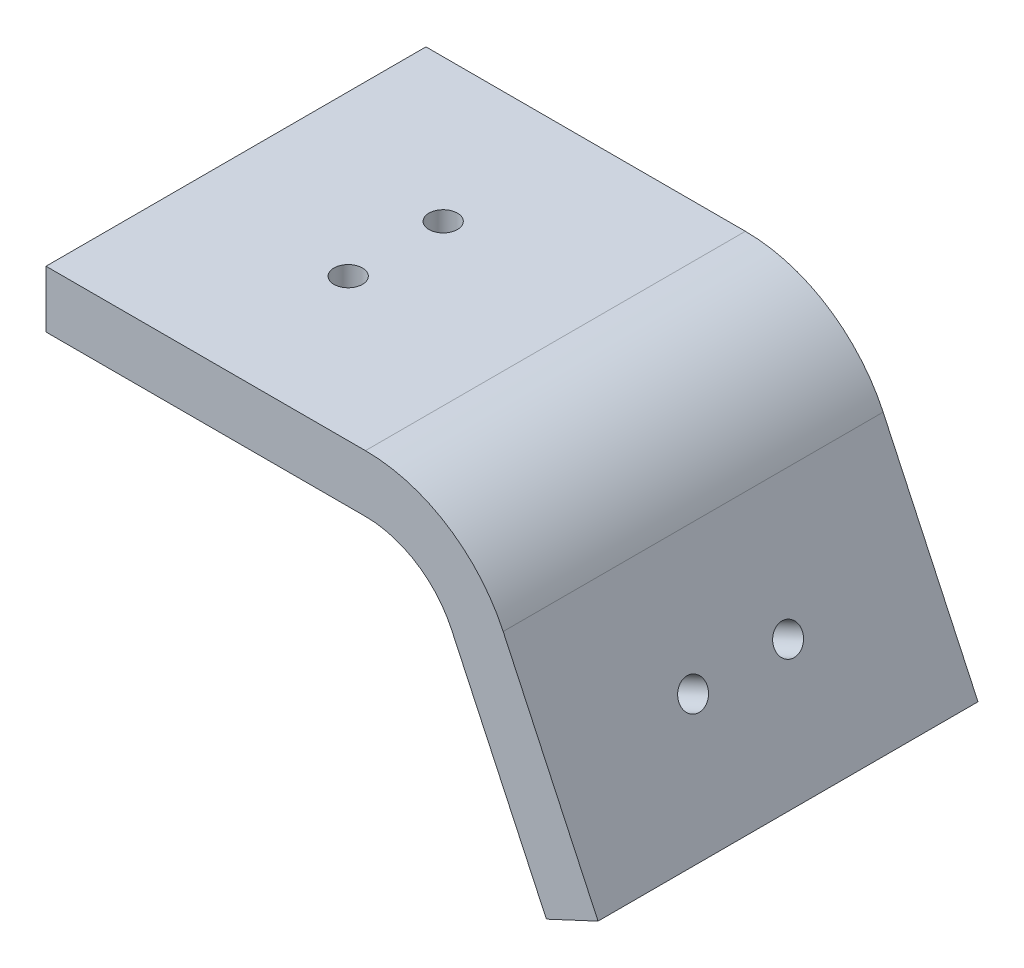
ISO-10303-21;
HEADER;
FILE_DESCRIPTION(('STEP AP214'),'2;1');
FILE_NAME('part.step','',(''),(''),'','','');
FILE_SCHEMA(('AUTOMOTIVE_DESIGN { 1 0 10303 214 1 1 1 1 }'));
ENDSEC;
DATA;
#1=APPLICATION_CONTEXT('core data for automotive mechanical design processes');
#2=APPLICATION_PROTOCOL_DEFINITION('international standard','automotive_design',2000,#1);
#3=PRODUCT_CONTEXT('',#1,'mechanical');
#4=PRODUCT('Part','Part','',(#3));
#5=PRODUCT_RELATED_PRODUCT_CATEGORY('part','',(#4));
#6=PRODUCT_DEFINITION_FORMATION('','',#4);
#7=PRODUCT_DEFINITION_CONTEXT('part definition',#1,'design');
#8=PRODUCT_DEFINITION('design','',#6,#7);
#9=PRODUCT_DEFINITION_SHAPE('','',#8);
#10=(LENGTH_UNIT() NAMED_UNIT(*) SI_UNIT(.MILLI.,.METRE.));
#11=(NAMED_UNIT(*) PLANE_ANGLE_UNIT() SI_UNIT($,.RADIAN.));
#12=(NAMED_UNIT(*) SI_UNIT($,.STERADIAN.) SOLID_ANGLE_UNIT());
#13=UNCERTAINTY_MEASURE_WITH_UNIT(LENGTH_MEASURE(1.E-05),#10,'distance_accuracy_value','');
#14=(GEOMETRIC_REPRESENTATION_CONTEXT(3) GLOBAL_UNCERTAINTY_ASSIGNED_CONTEXT((#13)) GLOBAL_UNIT_ASSIGNED_CONTEXT((#10,
#11,#12)) REPRESENTATION_CONTEXT('',''));
#15=CARTESIAN_POINT('',(0.,0.,0.));
#16=DIRECTION('',(0.,0.,1.));
#17=DIRECTION('',(1.,0.,0.));
#18=AXIS2_PLACEMENT_3D('',#15,#16,#17);
#19=CARTESIAN_POINT('',(5.43784672221991,2.53570957044418,40.));
#20=DIRECTION('',(-0.422618261740697,0.906307787036651,0.));
#21=DIRECTION('',(-0.906307787036651,-0.422618261740697,0.));
#22=AXIS2_PLACEMENT_3D('',#19,#20,#21);
#23=PLANE('',#22);
#24=DIRECTION('',(0.906307787036651,0.422618261740697,0.));
#25=VECTOR('',#24,1.);
#26=CARTESIAN_POINT('',(5.43784672221991,2.53570957044418,0.));
#27=LINE('',#26,#25);
#28=CARTESIAN_POINT('',(0.,0.,0.));
#29=VERTEX_POINT('',#28);
#30=CARTESIAN_POINT('',(5.43784672221991,2.53570957044418,0.));
#31=VERTEX_POINT('',#30);
#32=EDGE_CURVE('E130',#29,#31,#27,.T.);
#33=ORIENTED_EDGE('',*,*,#32,.T.);
#34=DIRECTION('',(0.,0.,-1.));
#35=VECTOR('',#34,1.);
#36=CARTESIAN_POINT('',(5.43784672221991,2.53570957044418,40.));
#37=LINE('',#36,#35);
#38=CARTESIAN_POINT('',(5.43784672221991,2.53570957044418,40.));
#39=VERTEX_POINT('',#38);
#40=EDGE_CURVE('E11',#39,#31,#37,.T.);
#41=ORIENTED_EDGE('',*,*,#40,.F.);
#42=DIRECTION('',(0.906307787036651,0.422618261740697,0.));
#43=VECTOR('',#42,1.);
#44=CARTESIAN_POINT('',(5.43784672221991,2.53570957044418,40.));
#45=LINE('',#44,#43);
#46=CARTESIAN_POINT('',(0.,0.,40.));
#47=VERTEX_POINT('',#46);
#48=EDGE_CURVE('E145',#47,#39,#45,.T.);
#49=ORIENTED_EDGE('',*,*,#48,.F.);
#50=DIRECTION('',(0.,0.,-1.));
#51=VECTOR('',#50,1.);
#52=CARTESIAN_POINT('',(0.,0.,40.));
#53=LINE('',#52,#51);
#54=EDGE_CURVE('E126',#47,#29,#53,.T.);
#55=ORIENTED_EDGE('',*,*,#54,.T.);
#56=EDGE_LOOP('',(#33,#41,#49,#55));
#57=FACE_BOUND('',#56,.T.);
#58=ADVANCED_FACE('F32',(#57),#23,.F.);
#59=CARTESIAN_POINT('',(5.43784672221991,2.53570957044418,40.));
#60=DIRECTION('',(-0.906307787036651,-0.422618261740697,0.));
#61=DIRECTION('',(0.422618261740697,-0.906307787036651,0.));
#62=AXIS2_PLACEMENT_3D('',#59,#60,#61);
#63=PLANE('',#62);
#64=CARTESIAN_POINT('',(0.444760427255241,13.2434176846974,25.));
#65=DIRECTION('',(0.906307787036651,0.422618261740697,0.));
#66=DIRECTION('',(0.422618261740697,-0.906307787036651,0.));
#67=AXIS2_PLACEMENT_3D('',#64,#65,#66);
#68=CIRCLE('',#67,1.5);
#69=CARTESIAN_POINT('',(1.07868781986629,11.8839560041424,25.));
#70=VERTEX_POINT('',#69);
#71=EDGE_CURVE('E175',#70,#70,#68,.T.);
#72=ORIENTED_EDGE('',*,*,#71,.F.);
#73=EDGE_LOOP('',(#72));
#74=FACE_BOUND('',#73,.T.);
#75=CARTESIAN_POINT('',(0.444760427255241,13.2434176846974,15.));
#76=DIRECTION('',(0.906307787036651,0.422618261740697,0.));
#77=DIRECTION('',(-0.422618261740697,0.906307787036651,0.));
#78=AXIS2_PLACEMENT_3D('',#75,#76,#77);
#79=CIRCLE('',#78,1.5);
#80=CARTESIAN_POINT('',(-0.189166965355805,14.6028793652524,15.));
#81=VERTEX_POINT('',#80);
#82=EDGE_CURVE('E165',#81,#81,#79,.T.);
#83=ORIENTED_EDGE('',*,*,#82,.F.);
#84=EDGE_LOOP('',(#83));
#85=FACE_BOUND('',#84,.T.);
#86=DIRECTION('',(-0.422618261740697,0.906307787036651,0.));
#87=VECTOR('',#86,1.);
#88=CARTESIAN_POINT('',(5.43784672221991,2.53570957044418,0.));
#89=LINE('',#88,#87);
#90=CARTESIAN_POINT('',(-4.54832586770942,23.9511257989506,0.));
#91=VERTEX_POINT('',#90);
#92=EDGE_CURVE('E133',#31,#91,#89,.T.);
#93=ORIENTED_EDGE('',*,*,#92,.T.);
#94=DIRECTION('',(0.,0.,-1.));
#95=VECTOR('',#94,1.);
#96=CARTESIAN_POINT('',(-4.54832586770942,23.9511257989506,40.));
#97=LINE('',#96,#95);
#98=CARTESIAN_POINT('',(-4.54832586770942,23.9511257989506,40.));
#99=VERTEX_POINT('',#98);
#100=EDGE_CURVE('E41',#99,#91,#97,.T.);
#101=ORIENTED_EDGE('',*,*,#100,.F.);
#102=DIRECTION('',(-0.422618261740697,0.906307787036651,0.));
#103=VECTOR('',#102,1.);
#104=CARTESIAN_POINT('',(5.43784672221991,2.53570957044418,40.));
#105=LINE('',#104,#103);
#106=EDGE_CURVE('E93',#39,#99,#105,.T.);
#107=ORIENTED_EDGE('',*,*,#106,.F.);
#108=ORIENTED_EDGE('',*,*,#40,.T.);
#109=EDGE_LOOP('',(#93,#101,#107,#108));
#110=FACE_BOUND('',#109,.T.);
#111=ADVANCED_FACE('F214',(#74,#85,#110),#63,.F.);
#112=CARTESIAN_POINT('',(-19.0492504602959,17.1892336110995,40.));
#113=DIRECTION('',(0.,0.,-1.));
#114=DIRECTION('',(-1.,0.,0.));
#115=AXIS2_PLACEMENT_3D('',#112,#113,#114);
#116=CYLINDRICAL_SURFACE('',#115,16.);
#117=CARTESIAN_POINT('',(-19.0492504602959,17.1892336110995,0.));
#118=DIRECTION('',(0.,0.,1.));
#119=DIRECTION('',(1.,0.,0.));
#120=AXIS2_PLACEMENT_3D('',#117,#118,#119);
#121=CIRCLE('',#120,16.);
#122=CARTESIAN_POINT('',(-19.0492504602959,33.1892336110995,0.));
#123=VERTEX_POINT('',#122);
#124=EDGE_CURVE('E136',#91,#123,#121,.T.);
#125=ORIENTED_EDGE('',*,*,#124,.T.);
#126=DIRECTION('',(0.,0.,-1.));
#127=VECTOR('',#126,1.);
#128=CARTESIAN_POINT('',(-19.0492504602959,33.1892336110995,40.));
#129=LINE('',#128,#127);
#130=CARTESIAN_POINT('',(-19.0492504602959,33.1892336110995,40.));
#131=VERTEX_POINT('',#130);
#132=EDGE_CURVE('E152',#131,#123,#129,.T.);
#133=ORIENTED_EDGE('',*,*,#132,.F.);
#134=CARTESIAN_POINT('',(-19.0492504602959,17.1892336110995,40.));
#135=DIRECTION('',(0.,0.,1.));
#136=DIRECTION('',(1.,0.,0.));
#137=AXIS2_PLACEMENT_3D('',#134,#135,#136);
#138=CIRCLE('',#137,16.);
#139=EDGE_CURVE('E182',#99,#131,#138,.T.);
#140=ORIENTED_EDGE('',*,*,#139,.F.);
#141=ORIENTED_EDGE('',*,*,#100,.T.);
#142=EDGE_LOOP('',(#125,#133,#140,#141));
#143=FACE_BOUND('',#142,.T.);
#144=ADVANCED_FACE('F218',(#143),#116,.T.);
#145=CARTESIAN_POINT('',(-19.0492504602959,33.1892336110995,40.));
#146=DIRECTION('',(0.,-1.,0.));
#147=DIRECTION('',(0.,0.,-1.));
#148=AXIS2_PLACEMENT_3D('',#145,#146,#147);
#149=PLANE('',#148);
#150=CARTESIAN_POINT('',(-35.8638991562584,33.1892336110995,25.));
#151=DIRECTION('',(0.,1.,0.));
#152=DIRECTION('',(0.,0.,1.));
#153=AXIS2_PLACEMENT_3D('',#150,#151,#152);
#154=CIRCLE('',#153,1.5);
#155=CARTESIAN_POINT('',(-35.8638991562584,33.1892336110995,26.5));
#156=VERTEX_POINT('',#155);
#157=EDGE_CURVE('E162',#156,#156,#154,.F.);
#158=ORIENTED_EDGE('',*,*,#157,.T.);
#159=EDGE_LOOP('',(#158));
#160=FACE_BOUND('',#159,.T.);
#161=CARTESIAN_POINT('',(-35.8638991562584,33.1892336110995,15.));
#162=DIRECTION('',(0.,1.,0.));
#163=DIRECTION('',(0.,0.,1.));
#164=AXIS2_PLACEMENT_3D('',#161,#162,#163);
#165=CIRCLE('',#164,1.5);
#166=CARTESIAN_POINT('',(-35.8638991562584,33.1892336110995,16.5));
#167=VERTEX_POINT('',#166);
#168=EDGE_CURVE('E159',#167,#167,#165,.T.);
#169=ORIENTED_EDGE('',*,*,#168,.F.);
#170=EDGE_LOOP('',(#169));
#171=FACE_BOUND('',#170,.T.);
#172=DIRECTION('',(-1.,0.,0.));
#173=VECTOR('',#172,1.);
#174=CARTESIAN_POINT('',(-19.0492504602959,33.1892336110995,0.));
#175=LINE('',#174,#173);
#176=CARTESIAN_POINT('',(-52.6785478522209,33.1892336110995,0.));
#177=VERTEX_POINT('',#176);
#178=EDGE_CURVE('E138',#123,#177,#175,.T.);
#179=ORIENTED_EDGE('',*,*,#178,.T.);
#180=DIRECTION('',(0.,0.,-1.));
#181=VECTOR('',#180,1.);
#182=CARTESIAN_POINT('',(-52.6785478522209,33.1892336110995,40.));
#183=LINE('',#182,#181);
#184=CARTESIAN_POINT('',(-52.6785478522209,33.1892336110995,40.));
#185=VERTEX_POINT('',#184);
#186=EDGE_CURVE('E149',#185,#177,#183,.T.);
#187=ORIENTED_EDGE('',*,*,#186,.F.);
#188=DIRECTION('',(-1.,0.,0.));
#189=VECTOR('',#188,1.);
#190=CARTESIAN_POINT('',(-19.0492504602959,33.1892336110995,40.));
#191=LINE('',#190,#189);
#192=EDGE_CURVE('E184',#131,#185,#191,.T.);
#193=ORIENTED_EDGE('',*,*,#192,.F.);
#194=ORIENTED_EDGE('',*,*,#132,.T.);
#195=EDGE_LOOP('',(#179,#187,#193,#194));
#196=FACE_BOUND('',#195,.T.);
#197=ADVANCED_FACE('F190',(#160,#171,#196),#149,.F.);
#198=CARTESIAN_POINT('',(-52.6785478522209,33.1892336110995,40.));
#199=DIRECTION('',(1.,0.,0.));
#200=DIRECTION('',(0.,0.,-1.));
#201=AXIS2_PLACEMENT_3D('',#198,#199,#200);
#202=PLANE('',#201);
#203=DIRECTION('',(0.,-1.,0.));
#204=VECTOR('',#203,1.);
#205=CARTESIAN_POINT('',(-52.6785478522209,33.1892336110995,0.));
#206=LINE('',#205,#204);
#207=CARTESIAN_POINT('',(-52.6785478522209,27.1892336110995,0.));
#208=VERTEX_POINT('',#207);
#209=EDGE_CURVE('E140',#177,#208,#206,.T.);
#210=ORIENTED_EDGE('',*,*,#209,.T.);
#211=DIRECTION('',(0.,0.,-1.));
#212=VECTOR('',#211,1.);
#213=CARTESIAN_POINT('',(-52.6785478522209,27.1892336110995,40.));
#214=LINE('',#213,#212);
#215=CARTESIAN_POINT('',(-52.6785478522209,27.1892336110995,40.));
#216=VERTEX_POINT('',#215);
#217=EDGE_CURVE('E121',#216,#208,#214,.T.);
#218=ORIENTED_EDGE('',*,*,#217,.F.);
#219=DIRECTION('',(0.,-1.,0.));
#220=VECTOR('',#219,1.);
#221=CARTESIAN_POINT('',(-52.6785478522209,33.1892336110995,40.));
#222=LINE('',#221,#220);
#223=EDGE_CURVE('E112',#185,#216,#222,.T.);
#224=ORIENTED_EDGE('',*,*,#223,.F.);
#225=ORIENTED_EDGE('',*,*,#186,.T.);
#226=EDGE_LOOP('',(#210,#218,#224,#225));
#227=FACE_BOUND('',#226,.T.);
#228=ADVANCED_FACE('F194',(#227),#202,.F.);
#229=CARTESIAN_POINT('',(-19.0492504602959,27.1892336110995,40.));
#230=DIRECTION('',(0.,1.,0.));
#231=DIRECTION('',(-1.,0.,0.));
#232=AXIS2_PLACEMENT_3D('',#229,#230,#231);
#233=PLANE('',#232);
#234=CARTESIAN_POINT('',(-35.8638991562584,27.1892336110995,25.));
#235=DIRECTION('',(0.,1.,0.));
#236=DIRECTION('',(-1.,0.,0.));
#237=AXIS2_PLACEMENT_3D('',#234,#235,#236);
#238=CIRCLE('',#237,1.5);
#239=CARTESIAN_POINT('',(-37.3638991562584,27.1892336110995,25.));
#240=VERTEX_POINT('',#239);
#241=EDGE_CURVE('E160',#240,#240,#238,.F.);
#242=ORIENTED_EDGE('',*,*,#241,.F.);
#243=EDGE_LOOP('',(#242));
#244=FACE_BOUND('',#243,.T.);
#245=CARTESIAN_POINT('',(-35.8638991562584,27.1892336110995,15.));
#246=DIRECTION('',(0.,1.,0.));
#247=DIRECTION('',(-1.,0.,0.));
#248=AXIS2_PLACEMENT_3D('',#245,#246,#247);
#249=CIRCLE('',#248,1.5);
#250=CARTESIAN_POINT('',(-37.3638991562584,27.1892336110995,15.));
#251=VERTEX_POINT('',#250);
#252=EDGE_CURVE('E134',#251,#251,#249,.T.);
#253=ORIENTED_EDGE('',*,*,#252,.T.);
#254=EDGE_LOOP('',(#253));
#255=FACE_BOUND('',#254,.T.);
#256=DIRECTION('',(1.,0.,0.));
#257=VECTOR('',#256,1.);
#258=CARTESIAN_POINT('',(-19.0492504602959,27.1892336110995,0.));
#259=LINE('',#258,#257);
#260=CARTESIAN_POINT('',(-19.0492504602959,27.1892336110995,0.));
#261=VERTEX_POINT('',#260);
#262=EDGE_CURVE('E120',#208,#261,#259,.T.);
#263=ORIENTED_EDGE('',*,*,#262,.T.);
#264=DIRECTION('',(0.,0.,-1.));
#265=VECTOR('',#264,1.);
#266=CARTESIAN_POINT('',(-19.0492504602959,27.1892336110995,40.));
#267=LINE('',#266,#265);
#268=CARTESIAN_POINT('',(-19.0492504602959,27.1892336110995,40.));
#269=VERTEX_POINT('',#268);
#270=EDGE_CURVE('E117',#269,#261,#267,.T.);
#271=ORIENTED_EDGE('',*,*,#270,.F.);
#272=DIRECTION('',(1.,0.,0.));
#273=VECTOR('',#272,1.);
#274=CARTESIAN_POINT('',(-19.0492504602959,27.1892336110995,40.));
#275=LINE('',#274,#273);
#276=EDGE_CURVE('E106',#216,#269,#275,.T.);
#277=ORIENTED_EDGE('',*,*,#276,.F.);
#278=ORIENTED_EDGE('',*,*,#217,.T.);
#279=EDGE_LOOP('',(#263,#271,#277,#278));
#280=FACE_BOUND('',#279,.T.);
#281=ADVANCED_FACE('F118',(#244,#255,#280),#233,.F.);
#282=CARTESIAN_POINT('',(-19.0492504602959,17.1892336110995,40.));
#283=DIRECTION('',(0.,0.,-1.));
#284=DIRECTION('',(-1.,0.,0.));
#285=AXIS2_PLACEMENT_3D('',#282,#283,#284);
#286=CYLINDRICAL_SURFACE('',#285,10.);
#287=CARTESIAN_POINT('',(-19.0492504602959,17.1892336110995,0.));
#288=DIRECTION('',(0.,0.,-1.));
#289=DIRECTION('',(1.,0.,0.));
#290=AXIS2_PLACEMENT_3D('',#287,#288,#289);
#291=CIRCLE('',#290,10.);
#292=CARTESIAN_POINT('',(-9.98617258992933,21.4154162285065,0.));
#293=VERTEX_POINT('',#292);
#294=EDGE_CURVE('E79',#261,#293,#291,.T.);
#295=ORIENTED_EDGE('',*,*,#294,.T.);
#296=DIRECTION('',(0.,0.,-1.));
#297=VECTOR('',#296,1.);
#298=CARTESIAN_POINT('',(-9.98617258992933,21.4154162285065,40.));
#299=LINE('',#298,#297);
#300=CARTESIAN_POINT('',(-9.98617258992933,21.4154162285065,40.));
#301=VERTEX_POINT('',#300);
#302=EDGE_CURVE('E122',#301,#293,#299,.T.);
#303=ORIENTED_EDGE('',*,*,#302,.F.);
#304=CARTESIAN_POINT('',(-19.0492504602959,17.1892336110995,40.));
#305=DIRECTION('',(0.,0.,-1.));
#306=DIRECTION('',(1.,0.,0.));
#307=AXIS2_PLACEMENT_3D('',#304,#305,#306);
#308=CIRCLE('',#307,10.);
#309=EDGE_CURVE('E110',#269,#301,#308,.T.);
#310=ORIENTED_EDGE('',*,*,#309,.F.);
#311=ORIENTED_EDGE('',*,*,#270,.T.);
#312=EDGE_LOOP('',(#295,#303,#310,#311));
#313=FACE_BOUND('',#312,.T.);
#314=ADVANCED_FACE('F124',(#313),#286,.F.);
#315=CARTESIAN_POINT('',(0.,0.,40.));
#316=DIRECTION('',(0.906307787036651,0.422618261740697,0.));
#317=DIRECTION('',(-0.422618261740697,0.906307787036651,0.));
#318=AXIS2_PLACEMENT_3D('',#315,#316,#317);
#319=PLANE('',#318);
#320=CARTESIAN_POINT('',(-4.99308629496467,10.7077081142532,25.));
#321=DIRECTION('',(0.906307787036651,0.422618261740697,0.));
#322=DIRECTION('',(-0.422618261740697,0.906307787036651,0.));
#323=AXIS2_PLACEMENT_3D('',#320,#321,#322);
#324=CIRCLE('',#323,1.5);
#325=CARTESIAN_POINT('',(-5.62701368757572,12.0671697948082,25.));
#326=VERTEX_POINT('',#325);
#327=EDGE_CURVE('E35',#326,#326,#324,.T.);
#328=ORIENTED_EDGE('',*,*,#327,.T.);
#329=EDGE_LOOP('',(#328));
#330=FACE_BOUND('',#329,.T.);
#331=CARTESIAN_POINT('',(-4.99308629496467,10.7077081142532,15.));
#332=DIRECTION('',(0.906307787036651,0.422618261740697,0.));
#333=DIRECTION('',(-0.422618261740697,0.906307787036651,0.));
#334=AXIS2_PLACEMENT_3D('',#331,#332,#333);
#335=CIRCLE('',#334,1.5);
#336=CARTESIAN_POINT('',(-5.62701368757572,12.0671697948082,15.));
#337=VERTEX_POINT('',#336);
#338=EDGE_CURVE('E163',#337,#337,#335,.T.);
#339=ORIENTED_EDGE('',*,*,#338,.T.);
#340=EDGE_LOOP('',(#339));
#341=FACE_BOUND('',#340,.T.);
#342=DIRECTION('',(0.422618261740697,-0.906307787036651,0.));
#343=VECTOR('',#342,1.);
#344=CARTESIAN_POINT('',(0.,0.,0.));
#345=LINE('',#344,#343);
#346=EDGE_CURVE('E85',#293,#29,#345,.T.);
#347=ORIENTED_EDGE('',*,*,#346,.T.);
#348=ORIENTED_EDGE('',*,*,#54,.F.);
#349=DIRECTION('',(0.422618261740697,-0.906307787036651,0.));
#350=VECTOR('',#349,1.);
#351=CARTESIAN_POINT('',(0.,0.,40.));
#352=LINE('',#351,#350);
#353=EDGE_CURVE('E50',#301,#47,#352,.T.);
#354=ORIENTED_EDGE('',*,*,#353,.F.);
#355=ORIENTED_EDGE('',*,*,#302,.T.);
#356=EDGE_LOOP('',(#347,#348,#354,#355));
#357=FACE_BOUND('',#356,.T.);
#358=ADVANCED_FACE('F202',(#330,#341,#357),#319,.F.);
#359=CARTESIAN_POINT('',(-19.0492504602959,17.1892336110995,40.));
#360=DIRECTION('',(0.,0.,1.));
#361=DIRECTION('',(1.,0.,0.));
#362=AXIS2_PLACEMENT_3D('',#359,#360,#361);
#363=PLANE('',#362);
#364=ORIENTED_EDGE('',*,*,#48,.T.);
#365=ORIENTED_EDGE('',*,*,#106,.T.);
#366=ORIENTED_EDGE('',*,*,#139,.T.);
#367=ORIENTED_EDGE('',*,*,#192,.T.);
#368=ORIENTED_EDGE('',*,*,#223,.T.);
#369=ORIENTED_EDGE('',*,*,#276,.T.);
#370=ORIENTED_EDGE('',*,*,#309,.T.);
#371=ORIENTED_EDGE('',*,*,#353,.T.);
#372=EDGE_LOOP('',(#364,#365,#366,#367,#368,#369,#370,#371));
#373=FACE_BOUND('',#372,.T.);
#374=ADVANCED_FACE('F108',(#373),#363,.T.);
#375=CARTESIAN_POINT('',(-19.0492504602959,17.1892336110995,0.));
#376=DIRECTION('',(0.,0.,1.));
#377=DIRECTION('',(1.,0.,0.));
#378=AXIS2_PLACEMENT_3D('',#375,#376,#377);
#379=PLANE('',#378);
#380=ORIENTED_EDGE('',*,*,#32,.F.);
#381=ORIENTED_EDGE('',*,*,#346,.F.);
#382=ORIENTED_EDGE('',*,*,#294,.F.);
#383=ORIENTED_EDGE('',*,*,#262,.F.);
#384=ORIENTED_EDGE('',*,*,#209,.F.);
#385=ORIENTED_EDGE('',*,*,#178,.F.);
#386=ORIENTED_EDGE('',*,*,#124,.F.);
#387=ORIENTED_EDGE('',*,*,#92,.F.);
#388=EDGE_LOOP('',(#380,#381,#382,#383,#384,#385,#386,#387));
#389=FACE_BOUND('',#388,.T.);
#390=ADVANCED_FACE('F197',(#389),#379,.F.);
#391=CARTESIAN_POINT('',(-35.8638991562584,-6.81076638890047,15.));
#392=DIRECTION('',(0.,1.,0.));
#393=DIRECTION('',(0.,0.,1.));
#394=AXIS2_PLACEMENT_3D('',#391,#392,#393);
#395=CYLINDRICAL_SURFACE('',#394,1.5);
#396=ORIENTED_EDGE('',*,*,#168,.T.);
#397=EDGE_LOOP('',(#396));
#398=FACE_BOUND('',#397,.T.);
#399=ORIENTED_EDGE('',*,*,#252,.F.);
#400=EDGE_LOOP('',(#399));
#401=FACE_BOUND('',#400,.T.);
#402=ADVANCED_FACE('F241',(#398,#401),#395,.F.);
#403=CARTESIAN_POINT('',(-35.8638991562584,-6.81076638890047,25.));
#404=DIRECTION('',(0.,1.,0.));
#405=DIRECTION('',(0.,0.,1.));
#406=AXIS2_PLACEMENT_3D('',#403,#404,#405);
#407=CYLINDRICAL_SURFACE('',#406,1.5);
#408=ORIENTED_EDGE('',*,*,#157,.F.);
#409=EDGE_LOOP('',(#408));
#410=FACE_BOUND('',#409,.T.);
#411=ORIENTED_EDGE('',*,*,#241,.T.);
#412=EDGE_LOOP('',(#411));
#413=FACE_BOUND('',#412,.T.);
#414=ADVANCED_FACE('F243',(#410,#413),#407,.F.);
#415=CARTESIAN_POINT('',(-35.8075510542108,-3.66131278493047,15.));
#416=DIRECTION('',(0.906307787036651,0.422618261740697,0.));
#417=DIRECTION('',(-0.422618261740697,0.906307787036651,0.));
#418=AXIS2_PLACEMENT_3D('',#415,#416,#417);
#419=CYLINDRICAL_SURFACE('',#418,1.5);
#420=ORIENTED_EDGE('',*,*,#82,.T.);
#421=EDGE_LOOP('',(#420));
#422=FACE_BOUND('',#421,.T.);
#423=ORIENTED_EDGE('',*,*,#338,.F.);
#424=EDGE_LOOP('',(#423));
#425=FACE_BOUND('',#424,.T.);
#426=ADVANCED_FACE('F250',(#422,#425),#419,.F.);
#427=CARTESIAN_POINT('',(-35.8075510542108,-3.66131278493047,25.));
#428=DIRECTION('',(0.906307787036651,0.422618261740697,0.));
#429=DIRECTION('',(-0.422618261740697,0.906307787036651,0.));
#430=AXIS2_PLACEMENT_3D('',#427,#428,#429);
#431=CYLINDRICAL_SURFACE('',#430,1.5);
#432=ORIENTED_EDGE('',*,*,#71,.T.);
#433=EDGE_LOOP('',(#432));
#434=FACE_BOUND('',#433,.T.);
#435=ORIENTED_EDGE('',*,*,#327,.F.);
#436=EDGE_LOOP('',(#435));
#437=FACE_BOUND('',#436,.T.);
#438=ADVANCED_FACE('F256',(#434,#437),#431,.F.);
#439=CLOSED_SHELL('',(#58,#111,#144,#197,#228,#281,#314,#358,#374,#390,#402,#414,#426,#438));
#440=MANIFOLD_SOLID_BREP('B2',#439);
#441=ADVANCED_BREP_SHAPE_REPRESENTATION('',(#18,#440),#14);
#442=SHAPE_DEFINITION_REPRESENTATION(#9,#441);
ENDSEC;
END-ISO-10303-21;
